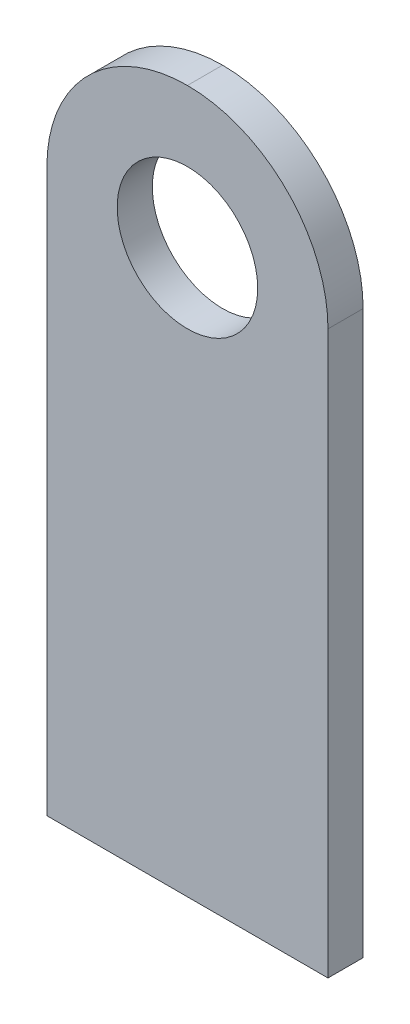
ISO-10303-21;
HEADER;
FILE_DESCRIPTION(('STEP AP214'),'2;1');
FILE_NAME('part.step','',(''),(''),'','','');
FILE_SCHEMA(('AUTOMOTIVE_DESIGN { 1 0 10303 214 1 1 1 1 }'));
ENDSEC;
DATA;
#1=APPLICATION_CONTEXT('core data for automotive mechanical design processes');
#2=APPLICATION_PROTOCOL_DEFINITION('international standard','automotive_design',2000,#1);
#3=PRODUCT_CONTEXT('',#1,'mechanical');
#4=PRODUCT('Part','Part','',(#3));
#5=PRODUCT_RELATED_PRODUCT_CATEGORY('part','',(#4));
#6=PRODUCT_DEFINITION_FORMATION('','',#4);
#7=PRODUCT_DEFINITION_CONTEXT('part definition',#1,'design');
#8=PRODUCT_DEFINITION('design','',#6,#7);
#9=PRODUCT_DEFINITION_SHAPE('','',#8);
#10=(LENGTH_UNIT() NAMED_UNIT(*) SI_UNIT(.MILLI.,.METRE.));
#11=(NAMED_UNIT(*) PLANE_ANGLE_UNIT() SI_UNIT($,.RADIAN.));
#12=(NAMED_UNIT(*) SI_UNIT($,.STERADIAN.) SOLID_ANGLE_UNIT());
#13=UNCERTAINTY_MEASURE_WITH_UNIT(LENGTH_MEASURE(1.E-05),#10,'distance_accuracy_value','');
#14=(GEOMETRIC_REPRESENTATION_CONTEXT(3) GLOBAL_UNCERTAINTY_ASSIGNED_CONTEXT((#13)) GLOBAL_UNIT_ASSIGNED_CONTEXT((#10,
#11,#12)) REPRESENTATION_CONTEXT('',''));
#15=CARTESIAN_POINT('',(0.,0.,0.));
#16=DIRECTION('',(0.,0.,1.));
#17=DIRECTION('',(1.,0.,0.));
#18=AXIS2_PLACEMENT_3D('',#15,#16,#17);
#19=CARTESIAN_POINT('',(2.,10.,-0.25));
#20=DIRECTION('',(-1.,0.,0.));
#21=DIRECTION('',(0.,0.,1.));
#22=AXIS2_PLACEMENT_3D('',#19,#20,#21);
#23=PLANE('',#22);
#24=DIRECTION('',(0.,-1.,0.));
#25=VECTOR('',#24,1.);
#26=CARTESIAN_POINT('',(2.,10.,-0.25));
#27=LINE('',#26,#25);
#28=CARTESIAN_POINT('',(2.,8.,-0.25));
#29=VERTEX_POINT('',#28);
#30=CARTESIAN_POINT('',(2.,0.,-0.25));
#31=VERTEX_POINT('',#30);
#32=EDGE_CURVE('E75',#29,#31,#27,.T.);
#33=ORIENTED_EDGE('',*,*,#32,.F.);
#34=DIRECTION('',(0.,0.,-1.));
#35=VECTOR('',#34,1.);
#36=CARTESIAN_POINT('',(2.,8.,0.25));
#37=LINE('',#36,#35);
#38=CARTESIAN_POINT('',(2.,8.,0.25));
#39=VERTEX_POINT('',#38);
#40=EDGE_CURVE('E11',#29,#39,#37,.F.);
#41=ORIENTED_EDGE('',*,*,#40,.T.);
#42=DIRECTION('',(0.,-1.,0.));
#43=VECTOR('',#42,1.);
#44=CARTESIAN_POINT('',(2.,10.,0.25));
#45=LINE('',#44,#43);
#46=CARTESIAN_POINT('',(2.,0.,0.25));
#47=VERTEX_POINT('',#46);
#48=EDGE_CURVE('E95',#39,#47,#45,.T.);
#49=ORIENTED_EDGE('',*,*,#48,.T.);
#50=DIRECTION('',(0.,0.,-1.));
#51=VECTOR('',#50,1.);
#52=CARTESIAN_POINT('',(2.,0.,-0.25));
#53=LINE('',#52,#51);
#54=EDGE_CURVE('E90',#47,#31,#53,.T.);
#55=ORIENTED_EDGE('',*,*,#54,.T.);
#56=EDGE_LOOP('',(#33,#41,#49,#55));
#57=FACE_BOUND('',#56,.T.);
#58=ADVANCED_FACE('F33',(#57),#23,.F.);
#59=CARTESIAN_POINT('',(-2.,10.,-0.25));
#60=DIRECTION('',(0.,0.,1.));
#61=DIRECTION('',(1.,0.,0.));
#62=AXIS2_PLACEMENT_3D('',#59,#60,#61);
#63=PLANE('',#62);
#64=CARTESIAN_POINT('',(0.,8.,-0.25));
#65=DIRECTION('',(0.,0.,1.));
#66=DIRECTION('',(1.,0.,0.));
#67=AXIS2_PLACEMENT_3D('',#64,#65,#66);
#68=CIRCLE('',#67,1.);
#69=CARTESIAN_POINT('',(1.,8.,-0.25));
#70=VERTEX_POINT('',#69);
#71=EDGE_CURVE('E99',#70,#70,#68,.F.);
#72=ORIENTED_EDGE('',*,*,#71,.F.);
#73=EDGE_LOOP('',(#72));
#74=FACE_BOUND('',#73,.T.);
#75=DIRECTION('',(0.,-1.,0.));
#76=VECTOR('',#75,1.);
#77=CARTESIAN_POINT('',(-2.,10.,-0.25));
#78=LINE('',#77,#76);
#79=CARTESIAN_POINT('',(-2.,8.,-0.25));
#80=VERTEX_POINT('',#79);
#81=CARTESIAN_POINT('',(-2.,0.,-0.25));
#82=VERTEX_POINT('',#81);
#83=EDGE_CURVE('E84',#80,#82,#78,.T.);
#84=ORIENTED_EDGE('',*,*,#83,.F.);
#85=CARTESIAN_POINT('',(0.,8.,-0.25));
#86=DIRECTION('',(0.,0.,1.));
#87=DIRECTION('',(1.,0.,0.));
#88=AXIS2_PLACEMENT_3D('',#85,#86,#87);
#89=CIRCLE('',#88,2.);
#90=CARTESIAN_POINT('',(0.,10.,-0.25));
#91=VERTEX_POINT('',#90);
#92=EDGE_CURVE('E42',#80,#91,#89,.F.);
#93=ORIENTED_EDGE('',*,*,#92,.T.);
#94=CARTESIAN_POINT('',(0.,8.,-0.25));
#95=DIRECTION('',(0.,0.,1.));
#96=DIRECTION('',(1.,0.,0.));
#97=AXIS2_PLACEMENT_3D('',#94,#95,#96);
#98=CIRCLE('',#97,2.);
#99=EDGE_CURVE('E49',#91,#29,#98,.F.);
#100=ORIENTED_EDGE('',*,*,#99,.T.);
#101=ORIENTED_EDGE('',*,*,#32,.T.);
#102=DIRECTION('',(-1.,0.,0.));
#103=VECTOR('',#102,1.);
#104=CARTESIAN_POINT('',(-2.,0.,-0.25));
#105=LINE('',#104,#103);
#106=EDGE_CURVE('E78',#31,#82,#105,.T.);
#107=ORIENTED_EDGE('',*,*,#106,.T.);
#108=EDGE_LOOP('',(#84,#93,#100,#101,#107));
#109=FACE_BOUND('',#108,.T.);
#110=ADVANCED_FACE('F77',(#74,#109),#63,.F.);
#111=CARTESIAN_POINT('',(-2.,10.,-0.25));
#112=DIRECTION('',(1.,0.,0.));
#113=DIRECTION('',(0.,0.,-1.));
#114=AXIS2_PLACEMENT_3D('',#111,#112,#113);
#115=PLANE('',#114);
#116=DIRECTION('',(0.,-1.,0.));
#117=VECTOR('',#116,1.);
#118=CARTESIAN_POINT('',(-2.,10.,0.25));
#119=LINE('',#118,#117);
#120=CARTESIAN_POINT('',(-2.,8.,0.25));
#121=VERTEX_POINT('',#120);
#122=CARTESIAN_POINT('',(-2.,0.,0.25));
#123=VERTEX_POINT('',#122);
#124=EDGE_CURVE('E107',#121,#123,#119,.T.);
#125=ORIENTED_EDGE('',*,*,#124,.F.);
#126=DIRECTION('',(0.,0.,1.));
#127=VECTOR('',#126,1.);
#128=CARTESIAN_POINT('',(-2.,8.,-0.25));
#129=LINE('',#128,#127);
#130=EDGE_CURVE('E113',#121,#80,#129,.F.);
#131=ORIENTED_EDGE('',*,*,#130,.T.);
#132=ORIENTED_EDGE('',*,*,#83,.T.);
#133=DIRECTION('',(0.,0.,1.));
#134=VECTOR('',#133,1.);
#135=CARTESIAN_POINT('',(-2.,0.,-0.25));
#136=LINE('',#135,#134);
#137=EDGE_CURVE('E92',#82,#123,#136,.T.);
#138=ORIENTED_EDGE('',*,*,#137,.T.);
#139=EDGE_LOOP('',(#125,#131,#132,#138));
#140=FACE_BOUND('',#139,.T.);
#141=ADVANCED_FACE('F120',(#140),#115,.F.);
#142=CARTESIAN_POINT('',(-2.,10.,0.25));
#143=DIRECTION('',(0.,0.,-1.));
#144=DIRECTION('',(-1.,0.,0.));
#145=AXIS2_PLACEMENT_3D('',#142,#143,#144);
#146=PLANE('',#145);
#147=CARTESIAN_POINT('',(0.,8.,0.25));
#148=DIRECTION('',(0.,0.,1.));
#149=DIRECTION('',(1.,0.,0.));
#150=AXIS2_PLACEMENT_3D('',#147,#148,#149);
#151=CIRCLE('',#150,1.);
#152=CARTESIAN_POINT('',(1.,8.,0.25));
#153=VERTEX_POINT('',#152);
#154=EDGE_CURVE('E200',#153,#153,#151,.T.);
#155=ORIENTED_EDGE('',*,*,#154,.F.);
#156=EDGE_LOOP('',(#155));
#157=FACE_BOUND('',#156,.T.);
#158=CARTESIAN_POINT('',(0.,8.,0.25));
#159=DIRECTION('',(0.,0.,-1.));
#160=DIRECTION('',(-1.,0.,0.));
#161=AXIS2_PLACEMENT_3D('',#158,#159,#160);
#162=CIRCLE('',#161,2.);
#163=CARTESIAN_POINT('',(0.,10.,0.25));
#164=VERTEX_POINT('',#163);
#165=EDGE_CURVE('E83',#39,#164,#162,.F.);
#166=ORIENTED_EDGE('',*,*,#165,.T.);
#167=CARTESIAN_POINT('',(0.,8.,0.25));
#168=DIRECTION('',(0.,0.,-1.));
#169=DIRECTION('',(-1.,0.,0.));
#170=AXIS2_PLACEMENT_3D('',#167,#168,#169);
#171=CIRCLE('',#170,2.);
#172=EDGE_CURVE('E111',#164,#121,#171,.F.);
#173=ORIENTED_EDGE('',*,*,#172,.T.);
#174=ORIENTED_EDGE('',*,*,#124,.T.);
#175=DIRECTION('',(1.,0.,0.));
#176=VECTOR('',#175,1.);
#177=CARTESIAN_POINT('',(-2.,0.,0.25));
#178=LINE('',#177,#176);
#179=EDGE_CURVE('E104',#123,#47,#178,.T.);
#180=ORIENTED_EDGE('',*,*,#179,.T.);
#181=ORIENTED_EDGE('',*,*,#48,.F.);
#182=EDGE_LOOP('',(#166,#173,#174,#180,#181));
#183=FACE_BOUND('',#182,.T.);
#184=ADVANCED_FACE('F128',(#157,#183),#146,.F.);
#185=CARTESIAN_POINT('',(0.,0.,0.));
#186=DIRECTION('',(0.,1.,0.));
#187=DIRECTION('',(0.,0.,1.));
#188=AXIS2_PLACEMENT_3D('',#185,#186,#187);
#189=PLANE('',#188);
#190=ORIENTED_EDGE('',*,*,#54,.F.);
#191=ORIENTED_EDGE('',*,*,#179,.F.);
#192=ORIENTED_EDGE('',*,*,#137,.F.);
#193=ORIENTED_EDGE('',*,*,#106,.F.);
#194=EDGE_LOOP('',(#190,#191,#192,#193));
#195=FACE_BOUND('',#194,.T.);
#196=ADVANCED_FACE('F88',(#195),#189,.F.);
#197=CARTESIAN_POINT('',(0.,8.,0.));
#198=DIRECTION('',(0.,0.,1.));
#199=DIRECTION('',(1.,0.,0.));
#200=AXIS2_PLACEMENT_3D('',#197,#198,#199);
#201=CYLINDRICAL_SURFACE('',#200,2.);
#202=ORIENTED_EDGE('',*,*,#40,.F.);
#203=ORIENTED_EDGE('',*,*,#99,.F.);
#204=DIRECTION('',(0.,0.,-1.));
#205=VECTOR('',#204,1.);
#206=CARTESIAN_POINT('',(0.,10.,-0.249999999999998));
#207=LINE('',#206,#205);
#208=EDGE_CURVE('E37',#164,#91,#207,.T.);
#209=ORIENTED_EDGE('',*,*,#208,.F.);
#210=ORIENTED_EDGE('',*,*,#165,.F.);
#211=EDGE_LOOP('',(#202,#203,#209,#210));
#212=FACE_BOUND('',#211,.T.);
#213=ADVANCED_FACE('F35',(#212),#201,.T.);
#214=CARTESIAN_POINT('',(0.,8.,0.));
#215=DIRECTION('',(0.,0.,-1.));
#216=DIRECTION('',(-1.,0.,0.));
#217=AXIS2_PLACEMENT_3D('',#214,#215,#216);
#218=CYLINDRICAL_SURFACE('',#217,2.);
#219=ORIENTED_EDGE('',*,*,#92,.F.);
#220=ORIENTED_EDGE('',*,*,#130,.F.);
#221=ORIENTED_EDGE('',*,*,#172,.F.);
#222=ORIENTED_EDGE('',*,*,#208,.T.);
#223=EDGE_LOOP('',(#219,#220,#221,#222));
#224=FACE_BOUND('',#223,.T.);
#225=ADVANCED_FACE('F123',(#224),#218,.T.);
#226=CARTESIAN_POINT('',(0.,8.,-3.07842712474619));
#227=DIRECTION('',(0.,0.,1.));
#228=DIRECTION('',(1.,0.,0.));
#229=AXIS2_PLACEMENT_3D('',#226,#227,#228);
#230=CYLINDRICAL_SURFACE('',#229,1.);
#231=ORIENTED_EDGE('',*,*,#71,.T.);
#232=EDGE_LOOP('',(#231));
#233=FACE_BOUND('',#232,.T.);
#234=ORIENTED_EDGE('',*,*,#154,.T.);
#235=EDGE_LOOP('',(#234));
#236=FACE_BOUND('',#235,.T.);
#237=ADVANCED_FACE('F147',(#233,#236),#230,.F.);
#238=CLOSED_SHELL('',(#58,#110,#141,#184,#196,#213,#225,#237));
#239=MANIFOLD_SOLID_BREP('B2',#238);
#240=ADVANCED_BREP_SHAPE_REPRESENTATION('',(#18,#239),#14);
#241=SHAPE_DEFINITION_REPRESENTATION(#9,#240);
ENDSEC;
END-ISO-10303-21;
